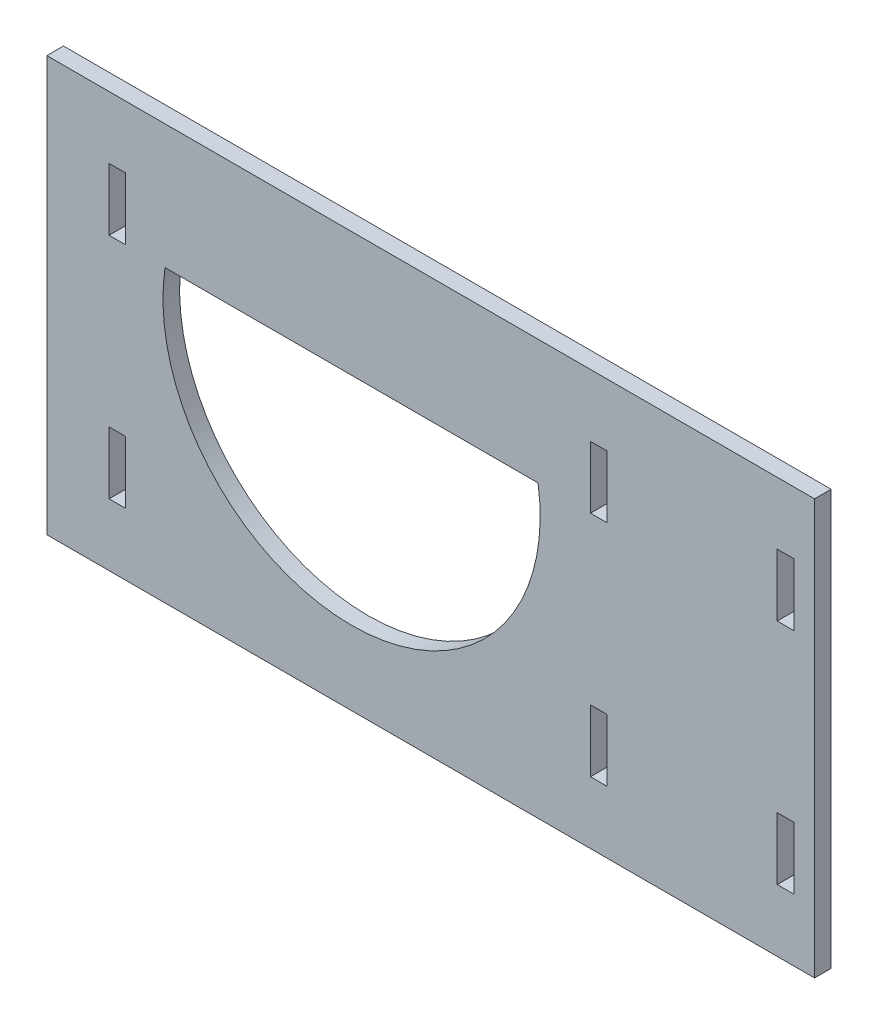
ISO-10303-21;
HEADER;
FILE_DESCRIPTION(('STEP AP214'),'2;1');
FILE_NAME('part.step','',(''),(''),'','','');
FILE_SCHEMA(('AUTOMOTIVE_DESIGN { 1 0 10303 214 1 1 1 1 }'));
ENDSEC;
DATA;
#1=APPLICATION_CONTEXT('core data for automotive mechanical design processes');
#2=APPLICATION_PROTOCOL_DEFINITION('international standard','automotive_design',2000,#1);
#3=PRODUCT_CONTEXT('',#1,'mechanical');
#4=PRODUCT('Part','Part','',(#3));
#5=PRODUCT_RELATED_PRODUCT_CATEGORY('part','',(#4));
#6=PRODUCT_DEFINITION_FORMATION('','',#4);
#7=PRODUCT_DEFINITION_CONTEXT('part definition',#1,'design');
#8=PRODUCT_DEFINITION('design','',#6,#7);
#9=PRODUCT_DEFINITION_SHAPE('','',#8);
#10=(LENGTH_UNIT() NAMED_UNIT(*) SI_UNIT(.MILLI.,.METRE.));
#11=(NAMED_UNIT(*) PLANE_ANGLE_UNIT() SI_UNIT($,.RADIAN.));
#12=(NAMED_UNIT(*) SI_UNIT($,.STERADIAN.) SOLID_ANGLE_UNIT());
#13=UNCERTAINTY_MEASURE_WITH_UNIT(LENGTH_MEASURE(1.E-05),#10,'distance_accuracy_value','');
#14=(GEOMETRIC_REPRESENTATION_CONTEXT(3) GLOBAL_UNCERTAINTY_ASSIGNED_CONTEXT((#13)) GLOBAL_UNIT_ASSIGNED_CONTEXT((#10,
#11,#12)) REPRESENTATION_CONTEXT('',''));
#15=CARTESIAN_POINT('',(0.,0.,0.));
#16=DIRECTION('',(0.,0.,1.));
#17=DIRECTION('',(1.,0.,0.));
#18=AXIS2_PLACEMENT_3D('',#15,#16,#17);
#19=CARTESIAN_POINT('',(0.,0.,4.));
#20=DIRECTION('',(0.,0.,-1.));
#21=DIRECTION('',(-1.,0.,0.));
#22=AXIS2_PLACEMENT_3D('',#19,#20,#21);
#23=PLANE('',#22);
#24=DIRECTION('',(0.,1.,0.));
#25=VECTOR('',#24,1.);
#26=CARTESIAN_POINT('',(105.,35.,4.));
#27=LINE('',#26,#25);
#28=CARTESIAN_POINT('',(105.,20.,4.));
#29=VERTEX_POINT('',#28);
#30=CARTESIAN_POINT('',(105.,35.,4.));
#31=VERTEX_POINT('',#30);
#32=EDGE_CURVE('E266',#29,#31,#27,.T.);
#33=ORIENTED_EDGE('',*,*,#32,.F.);
#34=DIRECTION('',(1.,0.,0.));
#35=VECTOR('',#34,1.);
#36=CARTESIAN_POINT('',(105.,20.,4.));
#37=LINE('',#36,#35);
#38=CARTESIAN_POINT('',(101.,20.,4.));
#39=VERTEX_POINT('',#38);
#40=EDGE_CURVE('E274',#39,#29,#37,.T.);
#41=ORIENTED_EDGE('',*,*,#40,.F.);
#42=DIRECTION('',(0.,-1.,0.));
#43=VECTOR('',#42,1.);
#44=CARTESIAN_POINT('',(101.,35.,4.));
#45=LINE('',#44,#43);
#46=CARTESIAN_POINT('',(101.,35.,4.));
#47=VERTEX_POINT('',#46);
#48=EDGE_CURVE('E271',#47,#39,#45,.T.);
#49=ORIENTED_EDGE('',*,*,#48,.F.);
#50=DIRECTION('',(-1.,0.,0.));
#51=VECTOR('',#50,1.);
#52=CARTESIAN_POINT('',(105.,35.,4.));
#53=LINE('',#52,#51);
#54=EDGE_CURVE('E268',#31,#47,#53,.T.);
#55=ORIENTED_EDGE('',*,*,#54,.F.);
#56=EDGE_LOOP('',(#33,#41,#49,#55));
#57=FACE_BOUND('',#56,.T.);
#58=DIRECTION('',(1.,0.,0.));
#59=VECTOR('',#58,1.);
#60=CARTESIAN_POINT('',(-56.,-35.,4.));
#61=LINE('',#60,#59);
#62=CARTESIAN_POINT('',(-60.,-35.,4.));
#63=VERTEX_POINT('',#62);
#64=CARTESIAN_POINT('',(-56.,-35.,4.));
#65=VERTEX_POINT('',#64);
#66=EDGE_CURVE('E328',#63,#65,#61,.T.);
#67=ORIENTED_EDGE('',*,*,#66,.F.);
#68=DIRECTION('',(0.,-1.,0.));
#69=VECTOR('',#68,1.);
#70=CARTESIAN_POINT('',(-60.,-35.,4.));
#71=LINE('',#70,#69);
#72=CARTESIAN_POINT('',(-60.,-20.,4.));
#73=VERTEX_POINT('',#72);
#74=EDGE_CURVE('E336',#73,#63,#71,.T.);
#75=ORIENTED_EDGE('',*,*,#74,.F.);
#76=DIRECTION('',(-1.,0.,0.));
#77=VECTOR('',#76,1.);
#78=CARTESIAN_POINT('',(-56.,-20.,4.));
#79=LINE('',#78,#77);
#80=CARTESIAN_POINT('',(-56.,-20.,4.));
#81=VERTEX_POINT('',#80);
#82=EDGE_CURVE('E333',#81,#73,#79,.T.);
#83=ORIENTED_EDGE('',*,*,#82,.F.);
#84=DIRECTION('',(0.,1.,0.));
#85=VECTOR('',#84,1.);
#86=CARTESIAN_POINT('',(-56.,-35.,4.));
#87=LINE('',#86,#85);
#88=EDGE_CURVE('E330',#65,#81,#87,.T.);
#89=ORIENTED_EDGE('',*,*,#88,.F.);
#90=EDGE_LOOP('',(#67,#75,#83,#89));
#91=FACE_BOUND('',#90,.T.);
#92=DIRECTION('',(0.,-1.,0.));
#93=VECTOR('',#92,1.);
#94=CARTESIAN_POINT('',(56.,35.,4.));
#95=LINE('',#94,#93);
#96=CARTESIAN_POINT('',(56.,35.,4.));
#97=VERTEX_POINT('',#96);
#98=CARTESIAN_POINT('',(56.,20.,4.));
#99=VERTEX_POINT('',#98);
#100=EDGE_CURVE('E390',#97,#99,#95,.T.);
#101=ORIENTED_EDGE('',*,*,#100,.F.);
#102=DIRECTION('',(-1.,0.,0.));
#103=VECTOR('',#102,1.);
#104=CARTESIAN_POINT('',(56.,35.,4.));
#105=LINE('',#104,#103);
#106=CARTESIAN_POINT('',(60.,35.,4.));
#107=VERTEX_POINT('',#106);
#108=EDGE_CURVE('E398',#107,#97,#105,.T.);
#109=ORIENTED_EDGE('',*,*,#108,.F.);
#110=DIRECTION('',(0.,1.,0.));
#111=VECTOR('',#110,1.);
#112=CARTESIAN_POINT('',(60.,35.,4.));
#113=LINE('',#112,#111);
#114=CARTESIAN_POINT('',(60.,20.,4.));
#115=VERTEX_POINT('',#114);
#116=EDGE_CURVE('E395',#115,#107,#113,.T.);
#117=ORIENTED_EDGE('',*,*,#116,.F.);
#118=DIRECTION('',(1.,0.,0.));
#119=VECTOR('',#118,1.);
#120=CARTESIAN_POINT('',(56.,20.,4.));
#121=LINE('',#120,#119);
#122=EDGE_CURVE('E392',#99,#115,#121,.T.);
#123=ORIENTED_EDGE('',*,*,#122,.F.);
#124=EDGE_LOOP('',(#101,#109,#117,#123));
#125=FACE_BOUND('',#124,.T.);
#126=DIRECTION('',(-1.,0.,0.));
#127=VECTOR('',#126,1.);
#128=CARTESIAN_POINT('',(75.,50.,4.));
#129=LINE('',#128,#127);
#130=CARTESIAN_POINT('',(110.,50.,4.));
#131=VERTEX_POINT('',#130);
#132=CARTESIAN_POINT('',(-75.,50.,4.));
#133=VERTEX_POINT('',#132);
#134=EDGE_CURVE('E438',#131,#133,#129,.T.);
#135=ORIENTED_EDGE('',*,*,#134,.T.);
#136=DIRECTION('',(0.,-1.,0.));
#137=VECTOR('',#136,1.);
#138=CARTESIAN_POINT('',(-75.,50.,4.));
#139=LINE('',#138,#137);
#140=CARTESIAN_POINT('',(-75.,-50.,4.));
#141=VERTEX_POINT('',#140);
#142=EDGE_CURVE('E440',#133,#141,#139,.T.);
#143=ORIENTED_EDGE('',*,*,#142,.T.);
#144=DIRECTION('',(1.,0.,0.));
#145=VECTOR('',#144,1.);
#146=CARTESIAN_POINT('',(-75.,-50.,4.));
#147=LINE('',#146,#145);
#148=CARTESIAN_POINT('',(110.,-50.,4.));
#149=VERTEX_POINT('',#148);
#150=EDGE_CURVE('E443',#141,#149,#147,.T.);
#151=ORIENTED_EDGE('',*,*,#150,.T.);
#152=DIRECTION('',(0.,1.,0.));
#153=VECTOR('',#152,1.);
#154=CARTESIAN_POINT('',(110.,50.,4.));
#155=LINE('',#154,#153);
#156=EDGE_CURVE('E445',#149,#131,#155,.T.);
#157=ORIENTED_EDGE('',*,*,#156,.T.);
#158=EDGE_LOOP('',(#135,#143,#151,#157));
#159=FACE_BOUND('',#158,.T.);
#160=CARTESIAN_POINT('',(-1.57065424336213,13.2673761716235,4.));
#161=DIRECTION('',(0.,0.,1.));
#162=DIRECTION('',(1.,0.,0.));
#163=AXIS2_PLACEMENT_3D('',#160,#161,#162);
#164=CIRCLE('',#163,45.4470877340791);
#165=CARTESIAN_POINT('',(-46.5162831731553,20.,4.));
#166=VERTEX_POINT('',#165);
#167=CARTESIAN_POINT('',(43.374974686431,20.,4.));
#168=VERTEX_POINT('',#167);
#169=EDGE_CURVE('E421',#166,#168,#164,.T.);
#170=ORIENTED_EDGE('',*,*,#169,.F.);
#171=DIRECTION('',(-1.,0.,0.));
#172=VECTOR('',#171,1.);
#173=CARTESIAN_POINT('',(-46.5162831731553,20.,4.));
#174=LINE('',#173,#172);
#175=EDGE_CURVE('E424',#168,#166,#174,.T.);
#176=ORIENTED_EDGE('',*,*,#175,.F.);
#177=EDGE_LOOP('',(#170,#176));
#178=FACE_BOUND('',#177,.T.);
#179=DIRECTION('',(0.,-1.,0.));
#180=VECTOR('',#179,1.);
#181=CARTESIAN_POINT('',(56.,-35.,4.));
#182=LINE('',#181,#180);
#183=CARTESIAN_POINT('',(56.,-20.,4.));
#184=VERTEX_POINT('',#183);
#185=CARTESIAN_POINT('',(56.,-35.,4.));
#186=VERTEX_POINT('',#185);
#187=EDGE_CURVE('E359',#184,#186,#182,.T.);
#188=ORIENTED_EDGE('',*,*,#187,.F.);
#189=DIRECTION('',(-1.,0.,0.));
#190=VECTOR('',#189,1.);
#191=CARTESIAN_POINT('',(56.,-20.,4.));
#192=LINE('',#191,#190);
#193=CARTESIAN_POINT('',(60.,-20.,4.));
#194=VERTEX_POINT('',#193);
#195=EDGE_CURVE('E367',#194,#184,#192,.T.);
#196=ORIENTED_EDGE('',*,*,#195,.F.);
#197=DIRECTION('',(0.,1.,0.));
#198=VECTOR('',#197,1.);
#199=CARTESIAN_POINT('',(60.,-35.,4.));
#200=LINE('',#199,#198);
#201=CARTESIAN_POINT('',(60.,-35.,4.));
#202=VERTEX_POINT('',#201);
#203=EDGE_CURVE('E364',#202,#194,#200,.T.);
#204=ORIENTED_EDGE('',*,*,#203,.F.);
#205=DIRECTION('',(1.,0.,0.));
#206=VECTOR('',#205,1.);
#207=CARTESIAN_POINT('',(56.,-35.,4.));
#208=LINE('',#207,#206);
#209=EDGE_CURVE('E361',#186,#202,#208,.T.);
#210=ORIENTED_EDGE('',*,*,#209,.F.);
#211=EDGE_LOOP('',(#188,#196,#204,#210));
#212=FACE_BOUND('',#211,.T.);
#213=DIRECTION('',(0.,1.,0.));
#214=VECTOR('',#213,1.);
#215=CARTESIAN_POINT('',(-56.,35.,4.));
#216=LINE('',#215,#214);
#217=CARTESIAN_POINT('',(-56.,20.,4.));
#218=VERTEX_POINT('',#217);
#219=CARTESIAN_POINT('',(-56.,35.,4.));
#220=VERTEX_POINT('',#219);
#221=EDGE_CURVE('E297',#218,#220,#216,.T.);
#222=ORIENTED_EDGE('',*,*,#221,.F.);
#223=DIRECTION('',(1.,0.,0.));
#224=VECTOR('',#223,1.);
#225=CARTESIAN_POINT('',(-56.,20.,4.));
#226=LINE('',#225,#224);
#227=CARTESIAN_POINT('',(-60.,20.,4.));
#228=VERTEX_POINT('',#227);
#229=EDGE_CURVE('E305',#228,#218,#226,.T.);
#230=ORIENTED_EDGE('',*,*,#229,.F.);
#231=DIRECTION('',(0.,-1.,0.));
#232=VECTOR('',#231,1.);
#233=CARTESIAN_POINT('',(-60.,35.,4.));
#234=LINE('',#233,#232);
#235=CARTESIAN_POINT('',(-60.,35.,4.));
#236=VERTEX_POINT('',#235);
#237=EDGE_CURVE('E302',#236,#228,#234,.T.);
#238=ORIENTED_EDGE('',*,*,#237,.F.);
#239=DIRECTION('',(-1.,0.,0.));
#240=VECTOR('',#239,1.);
#241=CARTESIAN_POINT('',(-56.,35.,4.));
#242=LINE('',#241,#240);
#243=EDGE_CURVE('E299',#220,#236,#242,.T.);
#244=ORIENTED_EDGE('',*,*,#243,.F.);
#245=EDGE_LOOP('',(#222,#230,#238,#244));
#246=FACE_BOUND('',#245,.T.);
#247=DIRECTION('',(0.,1.,0.));
#248=VECTOR('',#247,1.);
#249=CARTESIAN_POINT('',(105.,-20.,4.));
#250=LINE('',#249,#248);
#251=CARTESIAN_POINT('',(105.,-35.,4.));
#252=VERTEX_POINT('',#251);
#253=CARTESIAN_POINT('',(105.,-20.,4.));
#254=VERTEX_POINT('',#253);
#255=EDGE_CURVE('E230',#252,#254,#250,.T.);
#256=ORIENTED_EDGE('',*,*,#255,.F.);
#257=DIRECTION('',(1.,0.,0.));
#258=VECTOR('',#257,1.);
#259=CARTESIAN_POINT('',(105.,-35.,4.));
#260=LINE('',#259,#258);
#261=CARTESIAN_POINT('',(101.,-35.,4.));
#262=VERTEX_POINT('',#261);
#263=EDGE_CURVE('E252',#262,#252,#260,.T.);
#264=ORIENTED_EDGE('',*,*,#263,.F.);
#265=DIRECTION('',(0.,-1.,0.));
#266=VECTOR('',#265,1.);
#267=CARTESIAN_POINT('',(101.,-20.,4.));
#268=LINE('',#267,#266);
#269=CARTESIAN_POINT('',(101.,-20.,4.));
#270=VERTEX_POINT('',#269);
#271=EDGE_CURVE('E250',#270,#262,#268,.T.);
#272=ORIENTED_EDGE('',*,*,#271,.F.);
#273=DIRECTION('',(-1.,0.,0.));
#274=VECTOR('',#273,1.);
#275=CARTESIAN_POINT('',(105.,-20.,4.));
#276=LINE('',#275,#274);
#277=EDGE_CURVE('E238',#254,#270,#276,.T.);
#278=ORIENTED_EDGE('',*,*,#277,.F.);
#279=EDGE_LOOP('',(#256,#264,#272,#278));
#280=FACE_BOUND('',#279,.T.);
#281=ADVANCED_FACE('F33',(#57,#91,#125,#159,#178,#212,#246,#280),#23,.F.);
#282=CARTESIAN_POINT('',(0.,0.,0.));
#283=DIRECTION('',(0.,0.,-1.));
#284=DIRECTION('',(-1.,0.,0.));
#285=AXIS2_PLACEMENT_3D('',#282,#283,#284);
#286=PLANE('',#285);
#287=DIRECTION('',(-1.,0.,0.));
#288=VECTOR('',#287,1.);
#289=CARTESIAN_POINT('',(-75.,50.,0.));
#290=LINE('',#289,#288);
#291=CARTESIAN_POINT('',(110.,50.,0.));
#292=VERTEX_POINT('',#291);
#293=CARTESIAN_POINT('',(-75.,50.,0.));
#294=VERTEX_POINT('',#293);
#295=EDGE_CURVE('E437',#292,#294,#290,.T.);
#296=ORIENTED_EDGE('',*,*,#295,.F.);
#297=DIRECTION('',(0.,1.,0.));
#298=VECTOR('',#297,1.);
#299=CARTESIAN_POINT('',(110.,50.,0.));
#300=LINE('',#299,#298);
#301=CARTESIAN_POINT('',(110.,-50.,0.));
#302=VERTEX_POINT('',#301);
#303=EDGE_CURVE('E441',#302,#292,#300,.T.);
#304=ORIENTED_EDGE('',*,*,#303,.F.);
#305=DIRECTION('',(1.,0.,0.));
#306=VECTOR('',#305,1.);
#307=CARTESIAN_POINT('',(110.,-50.,0.));
#308=LINE('',#307,#306);
#309=CARTESIAN_POINT('',(-75.,-50.,0.));
#310=VERTEX_POINT('',#309);
#311=EDGE_CURVE('E452',#310,#302,#308,.T.);
#312=ORIENTED_EDGE('',*,*,#311,.F.);
#313=DIRECTION('',(0.,-1.,0.));
#314=VECTOR('',#313,1.);
#315=CARTESIAN_POINT('',(-75.,50.,0.));
#316=LINE('',#315,#314);
#317=EDGE_CURVE('E449',#294,#310,#316,.T.);
#318=ORIENTED_EDGE('',*,*,#317,.F.);
#319=EDGE_LOOP('',(#296,#304,#312,#318));
#320=FACE_BOUND('',#319,.T.);
#321=DIRECTION('',(-1.,0.,0.));
#322=VECTOR('',#321,1.);
#323=CARTESIAN_POINT('',(-46.5162831731553,20.,0.));
#324=LINE('',#323,#322);
#325=CARTESIAN_POINT('',(43.374974686431,20.,0.));
#326=VERTEX_POINT('',#325);
#327=CARTESIAN_POINT('',(-46.5162831731553,20.,0.));
#328=VERTEX_POINT('',#327);
#329=EDGE_CURVE('E425',#326,#328,#324,.T.);
#330=ORIENTED_EDGE('',*,*,#329,.T.);
#331=CARTESIAN_POINT('',(-1.57065424336213,13.2673761716235,0.));
#332=DIRECTION('',(0.,0.,1.));
#333=DIRECTION('',(1.,0.,0.));
#334=AXIS2_PLACEMENT_3D('',#331,#332,#333);
#335=CIRCLE('',#334,45.4470877340791);
#336=EDGE_CURVE('E420',#328,#326,#335,.T.);
#337=ORIENTED_EDGE('',*,*,#336,.T.);
#338=EDGE_LOOP('',(#330,#337));
#339=FACE_BOUND('',#338,.T.);
#340=DIRECTION('',(-1.,0.,0.));
#341=VECTOR('',#340,1.);
#342=CARTESIAN_POINT('',(56.,35.,0.));
#343=LINE('',#342,#341);
#344=CARTESIAN_POINT('',(60.,35.,0.));
#345=VERTEX_POINT('',#344);
#346=CARTESIAN_POINT('',(56.,35.,0.));
#347=VERTEX_POINT('',#346);
#348=EDGE_CURVE('E393',#345,#347,#343,.T.);
#349=ORIENTED_EDGE('',*,*,#348,.T.);
#350=DIRECTION('',(0.,-1.,0.));
#351=VECTOR('',#350,1.);
#352=CARTESIAN_POINT('',(56.,35.,0.));
#353=LINE('',#352,#351);
#354=CARTESIAN_POINT('',(56.,20.,0.));
#355=VERTEX_POINT('',#354);
#356=EDGE_CURVE('E389',#347,#355,#353,.T.);
#357=ORIENTED_EDGE('',*,*,#356,.T.);
#358=DIRECTION('',(1.,0.,0.));
#359=VECTOR('',#358,1.);
#360=CARTESIAN_POINT('',(56.,20.,0.));
#361=LINE('',#360,#359);
#362=CARTESIAN_POINT('',(60.,20.,0.));
#363=VERTEX_POINT('',#362);
#364=EDGE_CURVE('E403',#355,#363,#361,.T.);
#365=ORIENTED_EDGE('',*,*,#364,.T.);
#366=DIRECTION('',(0.,1.,0.));
#367=VECTOR('',#366,1.);
#368=CARTESIAN_POINT('',(60.,35.,0.));
#369=LINE('',#368,#367);
#370=EDGE_CURVE('E406',#363,#345,#369,.T.);
#371=ORIENTED_EDGE('',*,*,#370,.T.);
#372=EDGE_LOOP('',(#349,#357,#365,#371));
#373=FACE_BOUND('',#372,.T.);
#374=DIRECTION('',(-1.,0.,0.));
#375=VECTOR('',#374,1.);
#376=CARTESIAN_POINT('',(56.,-20.,0.));
#377=LINE('',#376,#375);
#378=CARTESIAN_POINT('',(60.,-20.,0.));
#379=VERTEX_POINT('',#378);
#380=CARTESIAN_POINT('',(56.,-20.,0.));
#381=VERTEX_POINT('',#380);
#382=EDGE_CURVE('E362',#379,#381,#377,.T.);
#383=ORIENTED_EDGE('',*,*,#382,.T.);
#384=DIRECTION('',(0.,-1.,0.));
#385=VECTOR('',#384,1.);
#386=CARTESIAN_POINT('',(56.,-35.,0.));
#387=LINE('',#386,#385);
#388=CARTESIAN_POINT('',(56.,-35.,0.));
#389=VERTEX_POINT('',#388);
#390=EDGE_CURVE('E358',#381,#389,#387,.T.);
#391=ORIENTED_EDGE('',*,*,#390,.T.);
#392=DIRECTION('',(1.,0.,0.));
#393=VECTOR('',#392,1.);
#394=CARTESIAN_POINT('',(56.,-35.,0.));
#395=LINE('',#394,#393);
#396=CARTESIAN_POINT('',(60.,-35.,0.));
#397=VERTEX_POINT('',#396);
#398=EDGE_CURVE('E372',#389,#397,#395,.T.);
#399=ORIENTED_EDGE('',*,*,#398,.T.);
#400=DIRECTION('',(0.,1.,0.));
#401=VECTOR('',#400,1.);
#402=CARTESIAN_POINT('',(60.,-35.,0.));
#403=LINE('',#402,#401);
#404=EDGE_CURVE('E375',#397,#379,#403,.T.);
#405=ORIENTED_EDGE('',*,*,#404,.T.);
#406=EDGE_LOOP('',(#383,#391,#399,#405));
#407=FACE_BOUND('',#406,.T.);
#408=DIRECTION('',(0.,-1.,0.));
#409=VECTOR('',#408,1.);
#410=CARTESIAN_POINT('',(-60.,-35.,0.));
#411=LINE('',#410,#409);
#412=CARTESIAN_POINT('',(-60.,-20.,0.));
#413=VERTEX_POINT('',#412);
#414=CARTESIAN_POINT('',(-60.,-35.,0.));
#415=VERTEX_POINT('',#414);
#416=EDGE_CURVE('E331',#413,#415,#411,.T.);
#417=ORIENTED_EDGE('',*,*,#416,.T.);
#418=DIRECTION('',(1.,0.,0.));
#419=VECTOR('',#418,1.);
#420=CARTESIAN_POINT('',(-56.,-35.,0.));
#421=LINE('',#420,#419);
#422=CARTESIAN_POINT('',(-56.,-35.,0.));
#423=VERTEX_POINT('',#422);
#424=EDGE_CURVE('E327',#415,#423,#421,.T.);
#425=ORIENTED_EDGE('',*,*,#424,.T.);
#426=DIRECTION('',(0.,1.,0.));
#427=VECTOR('',#426,1.);
#428=CARTESIAN_POINT('',(-56.,-35.,0.));
#429=LINE('',#428,#427);
#430=CARTESIAN_POINT('',(-56.,-20.,0.));
#431=VERTEX_POINT('',#430);
#432=EDGE_CURVE('E341',#423,#431,#429,.T.);
#433=ORIENTED_EDGE('',*,*,#432,.T.);
#434=DIRECTION('',(-1.,0.,0.));
#435=VECTOR('',#434,1.);
#436=CARTESIAN_POINT('',(-56.,-20.,0.));
#437=LINE('',#436,#435);
#438=EDGE_CURVE('E344',#431,#413,#437,.T.);
#439=ORIENTED_EDGE('',*,*,#438,.T.);
#440=EDGE_LOOP('',(#417,#425,#433,#439));
#441=FACE_BOUND('',#440,.T.);
#442=DIRECTION('',(1.,0.,0.));
#443=VECTOR('',#442,1.);
#444=CARTESIAN_POINT('',(-56.,20.,0.));
#445=LINE('',#444,#443);
#446=CARTESIAN_POINT('',(-60.,20.,0.));
#447=VERTEX_POINT('',#446);
#448=CARTESIAN_POINT('',(-56.,20.,0.));
#449=VERTEX_POINT('',#448);
#450=EDGE_CURVE('E300',#447,#449,#445,.T.);
#451=ORIENTED_EDGE('',*,*,#450,.T.);
#452=DIRECTION('',(0.,1.,0.));
#453=VECTOR('',#452,1.);
#454=CARTESIAN_POINT('',(-56.,35.,0.));
#455=LINE('',#454,#453);
#456=CARTESIAN_POINT('',(-56.,35.,0.));
#457=VERTEX_POINT('',#456);
#458=EDGE_CURVE('E296',#449,#457,#455,.T.);
#459=ORIENTED_EDGE('',*,*,#458,.T.);
#460=DIRECTION('',(-1.,0.,0.));
#461=VECTOR('',#460,1.);
#462=CARTESIAN_POINT('',(-56.,35.,0.));
#463=LINE('',#462,#461);
#464=CARTESIAN_POINT('',(-60.,35.,0.));
#465=VERTEX_POINT('',#464);
#466=EDGE_CURVE('E310',#457,#465,#463,.T.);
#467=ORIENTED_EDGE('',*,*,#466,.T.);
#468=DIRECTION('',(0.,-1.,0.));
#469=VECTOR('',#468,1.);
#470=CARTESIAN_POINT('',(-60.,35.,0.));
#471=LINE('',#470,#469);
#472=EDGE_CURVE('E313',#465,#447,#471,.T.);
#473=ORIENTED_EDGE('',*,*,#472,.T.);
#474=EDGE_LOOP('',(#451,#459,#467,#473));
#475=FACE_BOUND('',#474,.T.);
#476=DIRECTION('',(1.,0.,0.));
#477=VECTOR('',#476,1.);
#478=CARTESIAN_POINT('',(105.,20.,0.));
#479=LINE('',#478,#477);
#480=CARTESIAN_POINT('',(101.,20.,0.));
#481=VERTEX_POINT('',#480);
#482=CARTESIAN_POINT('',(105.,20.,0.));
#483=VERTEX_POINT('',#482);
#484=EDGE_CURVE('E269',#481,#483,#479,.T.);
#485=ORIENTED_EDGE('',*,*,#484,.T.);
#486=DIRECTION('',(0.,1.,0.));
#487=VECTOR('',#486,1.);
#488=CARTESIAN_POINT('',(105.,35.,0.));
#489=LINE('',#488,#487);
#490=CARTESIAN_POINT('',(105.,35.,0.));
#491=VERTEX_POINT('',#490);
#492=EDGE_CURVE('E246',#483,#491,#489,.T.);
#493=ORIENTED_EDGE('',*,*,#492,.T.);
#494=DIRECTION('',(-1.,0.,0.));
#495=VECTOR('',#494,1.);
#496=CARTESIAN_POINT('',(105.,35.,0.));
#497=LINE('',#496,#495);
#498=CARTESIAN_POINT('',(101.,35.,0.));
#499=VERTEX_POINT('',#498);
#500=EDGE_CURVE('E279',#491,#499,#497,.T.);
#501=ORIENTED_EDGE('',*,*,#500,.T.);
#502=DIRECTION('',(0.,-1.,0.));
#503=VECTOR('',#502,1.);
#504=CARTESIAN_POINT('',(101.,35.,0.));
#505=LINE('',#504,#503);
#506=EDGE_CURVE('E282',#499,#481,#505,.T.);
#507=ORIENTED_EDGE('',*,*,#506,.T.);
#508=EDGE_LOOP('',(#485,#493,#501,#507));
#509=FACE_BOUND('',#508,.T.);
#510=DIRECTION('',(1.,0.,0.));
#511=VECTOR('',#510,1.);
#512=CARTESIAN_POINT('',(105.,-35.,0.));
#513=LINE('',#512,#511);
#514=CARTESIAN_POINT('',(101.,-35.,0.));
#515=VERTEX_POINT('',#514);
#516=CARTESIAN_POINT('',(105.,-35.,0.));
#517=VERTEX_POINT('',#516);
#518=EDGE_CURVE('E239',#515,#517,#513,.T.);
#519=ORIENTED_EDGE('',*,*,#518,.T.);
#520=DIRECTION('',(0.,1.,0.));
#521=VECTOR('',#520,1.);
#522=CARTESIAN_POINT('',(105.,-20.,0.));
#523=LINE('',#522,#521);
#524=CARTESIAN_POINT('',(105.,-20.,0.));
#525=VERTEX_POINT('',#524);
#526=EDGE_CURVE('E56',#517,#525,#523,.T.);
#527=ORIENTED_EDGE('',*,*,#526,.T.);
#528=DIRECTION('',(-1.,0.,0.));
#529=VECTOR('',#528,1.);
#530=CARTESIAN_POINT('',(105.,-20.,0.));
#531=LINE('',#530,#529);
#532=CARTESIAN_POINT('',(101.,-20.,0.));
#533=VERTEX_POINT('',#532);
#534=EDGE_CURVE('E245',#525,#533,#531,.T.);
#535=ORIENTED_EDGE('',*,*,#534,.T.);
#536=DIRECTION('',(0.,-1.,0.));
#537=VECTOR('',#536,1.);
#538=CARTESIAN_POINT('',(101.,-20.,0.));
#539=LINE('',#538,#537);
#540=EDGE_CURVE('E258',#533,#515,#539,.T.);
#541=ORIENTED_EDGE('',*,*,#540,.T.);
#542=EDGE_LOOP('',(#519,#527,#535,#541));
#543=FACE_BOUND('',#542,.T.);
#544=ADVANCED_FACE('F472',(#320,#339,#373,#407,#441,#475,#509,#543),#286,.T.);
#545=CARTESIAN_POINT('',(-75.,50.,4.));
#546=DIRECTION('',(0.,-1.,0.));
#547=DIRECTION('',(0.,0.,-1.));
#548=AXIS2_PLACEMENT_3D('',#545,#546,#547);
#549=PLANE('',#548);
#550=ORIENTED_EDGE('',*,*,#295,.T.);
#551=DIRECTION('',(0.,0.,-1.));
#552=VECTOR('',#551,1.);
#553=CARTESIAN_POINT('',(-75.,50.,4.));
#554=LINE('',#553,#552);
#555=EDGE_CURVE('E11',#133,#294,#554,.T.);
#556=ORIENTED_EDGE('',*,*,#555,.F.);
#557=ORIENTED_EDGE('',*,*,#134,.F.);
#558=DIRECTION('',(0.,0.,-1.));
#559=VECTOR('',#558,1.);
#560=CARTESIAN_POINT('',(110.,50.,4.));
#561=LINE('',#560,#559);
#562=EDGE_CURVE('E447',#131,#292,#561,.T.);
#563=ORIENTED_EDGE('',*,*,#562,.T.);
#564=EDGE_LOOP('',(#550,#556,#557,#563));
#565=FACE_BOUND('',#564,.T.);
#566=ADVANCED_FACE('F35',(#565),#549,.F.);
#567=CARTESIAN_POINT('',(-75.,50.,4.));
#568=DIRECTION('',(1.,0.,0.));
#569=DIRECTION('',(0.,0.,-1.));
#570=AXIS2_PLACEMENT_3D('',#567,#568,#569);
#571=PLANE('',#570);
#572=ORIENTED_EDGE('',*,*,#317,.T.);
#573=DIRECTION('',(0.,0.,-1.));
#574=VECTOR('',#573,1.);
#575=CARTESIAN_POINT('',(-75.,-50.,4.));
#576=LINE('',#575,#574);
#577=EDGE_CURVE('E41',#141,#310,#576,.T.);
#578=ORIENTED_EDGE('',*,*,#577,.F.);
#579=ORIENTED_EDGE('',*,*,#142,.F.);
#580=ORIENTED_EDGE('',*,*,#555,.T.);
#581=EDGE_LOOP('',(#572,#578,#579,#580));
#582=FACE_BOUND('',#581,.T.);
#583=ADVANCED_FACE('F468',(#582),#571,.F.);
#584=CARTESIAN_POINT('',(110.,-50.,4.));
#585=DIRECTION('',(0.,1.,0.));
#586=DIRECTION('',(-1.,0.,0.));
#587=AXIS2_PLACEMENT_3D('',#584,#585,#586);
#588=PLANE('',#587);
#589=ORIENTED_EDGE('',*,*,#311,.T.);
#590=DIRECTION('',(0.,0.,-1.));
#591=VECTOR('',#590,1.);
#592=CARTESIAN_POINT('',(110.,-50.,4.));
#593=LINE('',#592,#591);
#594=EDGE_CURVE('E458',#149,#302,#593,.T.);
#595=ORIENTED_EDGE('',*,*,#594,.F.);
#596=ORIENTED_EDGE('',*,*,#150,.F.);
#597=ORIENTED_EDGE('',*,*,#577,.T.);
#598=EDGE_LOOP('',(#589,#595,#596,#597));
#599=FACE_BOUND('',#598,.T.);
#600=ADVANCED_FACE('F464',(#599),#588,.F.);
#601=CARTESIAN_POINT('',(110.,50.,4.));
#602=DIRECTION('',(-1.,0.,0.));
#603=DIRECTION('',(0.,0.,1.));
#604=AXIS2_PLACEMENT_3D('',#601,#602,#603);
#605=PLANE('',#604);
#606=ORIENTED_EDGE('',*,*,#303,.T.);
#607=ORIENTED_EDGE('',*,*,#562,.F.);
#608=ORIENTED_EDGE('',*,*,#156,.F.);
#609=ORIENTED_EDGE('',*,*,#594,.T.);
#610=EDGE_LOOP('',(#606,#607,#608,#609));
#611=FACE_BOUND('',#610,.T.);
#612=ADVANCED_FACE('F477',(#611),#605,.F.);
#613=CARTESIAN_POINT('',(-1.57065424336213,13.2673761716235,4.));
#614=DIRECTION('',(0.,0.,-1.));
#615=DIRECTION('',(-1.,0.,0.));
#616=AXIS2_PLACEMENT_3D('',#613,#614,#615);
#617=CYLINDRICAL_SURFACE('',#616,45.4470877340791);
#618=ORIENTED_EDGE('',*,*,#336,.F.);
#619=DIRECTION('',(0.,0.,-1.));
#620=VECTOR('',#619,1.);
#621=CARTESIAN_POINT('',(-46.5162831731553,20.,4.));
#622=LINE('',#621,#620);
#623=EDGE_CURVE('E427',#166,#328,#622,.T.);
#624=ORIENTED_EDGE('',*,*,#623,.F.);
#625=ORIENTED_EDGE('',*,*,#169,.T.);
#626=DIRECTION('',(0.,0.,-1.));
#627=VECTOR('',#626,1.);
#628=CARTESIAN_POINT('',(43.374974686431,20.,4.));
#629=LINE('',#628,#627);
#630=EDGE_CURVE('E434',#168,#326,#629,.T.);
#631=ORIENTED_EDGE('',*,*,#630,.T.);
#632=EDGE_LOOP('',(#618,#624,#625,#631));
#633=FACE_BOUND('',#632,.T.);
#634=ADVANCED_FACE('F576',(#633),#617,.F.);
#635=CARTESIAN_POINT('',(-46.5162831731553,20.,4.));
#636=DIRECTION('',(0.,-1.,0.));
#637=DIRECTION('',(0.,0.,-1.));
#638=AXIS2_PLACEMENT_3D('',#635,#636,#637);
#639=PLANE('',#638);
#640=ORIENTED_EDGE('',*,*,#329,.F.);
#641=ORIENTED_EDGE('',*,*,#630,.F.);
#642=ORIENTED_EDGE('',*,*,#175,.T.);
#643=ORIENTED_EDGE('',*,*,#623,.T.);
#644=EDGE_LOOP('',(#640,#641,#642,#643));
#645=FACE_BOUND('',#644,.T.);
#646=ADVANCED_FACE('F572',(#645),#639,.T.);
#647=CARTESIAN_POINT('',(56.,35.,4.));
#648=DIRECTION('',(1.,0.,0.));
#649=DIRECTION('',(0.,1.,0.));
#650=AXIS2_PLACEMENT_3D('',#647,#648,#649);
#651=PLANE('',#650);
#652=ORIENTED_EDGE('',*,*,#356,.F.);
#653=DIRECTION('',(0.,0.,-1.));
#654=VECTOR('',#653,1.);
#655=CARTESIAN_POINT('',(56.,35.,4.));
#656=LINE('',#655,#654);
#657=EDGE_CURVE('E400',#97,#347,#656,.T.);
#658=ORIENTED_EDGE('',*,*,#657,.F.);
#659=ORIENTED_EDGE('',*,*,#100,.T.);
#660=DIRECTION('',(0.,0.,-1.));
#661=VECTOR('',#660,1.);
#662=CARTESIAN_POINT('',(56.,20.,4.));
#663=LINE('',#662,#661);
#664=EDGE_CURVE('E417',#99,#355,#663,.T.);
#665=ORIENTED_EDGE('',*,*,#664,.T.);
#666=EDGE_LOOP('',(#652,#658,#659,#665));
#667=FACE_BOUND('',#666,.T.);
#668=ADVANCED_FACE('F568',(#667),#651,.T.);
#669=CARTESIAN_POINT('',(56.,20.,4.));
#670=DIRECTION('',(0.,1.,0.));
#671=DIRECTION('',(0.,0.,1.));
#672=AXIS2_PLACEMENT_3D('',#669,#670,#671);
#673=PLANE('',#672);
#674=ORIENTED_EDGE('',*,*,#364,.F.);
#675=ORIENTED_EDGE('',*,*,#664,.F.);
#676=ORIENTED_EDGE('',*,*,#122,.T.);
#677=DIRECTION('',(0.,0.,-1.));
#678=VECTOR('',#677,1.);
#679=CARTESIAN_POINT('',(60.,20.,4.));
#680=LINE('',#679,#678);
#681=EDGE_CURVE('E415',#115,#363,#680,.T.);
#682=ORIENTED_EDGE('',*,*,#681,.T.);
#683=EDGE_LOOP('',(#674,#675,#676,#682));
#684=FACE_BOUND('',#683,.T.);
#685=ADVANCED_FACE('F564',(#684),#673,.T.);
#686=CARTESIAN_POINT('',(60.,35.,4.));
#687=DIRECTION('',(-1.,0.,0.));
#688=DIRECTION('',(0.,0.,1.));
#689=AXIS2_PLACEMENT_3D('',#686,#687,#688);
#690=PLANE('',#689);
#691=ORIENTED_EDGE('',*,*,#370,.F.);
#692=ORIENTED_EDGE('',*,*,#681,.F.);
#693=ORIENTED_EDGE('',*,*,#116,.T.);
#694=DIRECTION('',(0.,0.,-1.));
#695=VECTOR('',#694,1.);
#696=CARTESIAN_POINT('',(60.,35.,4.));
#697=LINE('',#696,#695);
#698=EDGE_CURVE('E413',#107,#345,#697,.T.);
#699=ORIENTED_EDGE('',*,*,#698,.T.);
#700=EDGE_LOOP('',(#691,#692,#693,#699));
#701=FACE_BOUND('',#700,.T.);
#702=ADVANCED_FACE('F560',(#701),#690,.T.);
#703=CARTESIAN_POINT('',(56.,35.,4.));
#704=DIRECTION('',(0.,-1.,0.));
#705=DIRECTION('',(0.,0.,-1.));
#706=AXIS2_PLACEMENT_3D('',#703,#704,#705);
#707=PLANE('',#706);
#708=ORIENTED_EDGE('',*,*,#348,.F.);
#709=ORIENTED_EDGE('',*,*,#698,.F.);
#710=ORIENTED_EDGE('',*,*,#108,.T.);
#711=ORIENTED_EDGE('',*,*,#657,.T.);
#712=EDGE_LOOP('',(#708,#709,#710,#711));
#713=FACE_BOUND('',#712,.T.);
#714=ADVANCED_FACE('F556',(#713),#707,.T.);
#715=CARTESIAN_POINT('',(56.,-35.,4.));
#716=DIRECTION('',(1.,0.,0.));
#717=DIRECTION('',(0.,1.,0.));
#718=AXIS2_PLACEMENT_3D('',#715,#716,#717);
#719=PLANE('',#718);
#720=ORIENTED_EDGE('',*,*,#390,.F.);
#721=DIRECTION('',(0.,0.,-1.));
#722=VECTOR('',#721,1.);
#723=CARTESIAN_POINT('',(56.,-20.,4.));
#724=LINE('',#723,#722);
#725=EDGE_CURVE('E369',#184,#381,#724,.T.);
#726=ORIENTED_EDGE('',*,*,#725,.F.);
#727=ORIENTED_EDGE('',*,*,#187,.T.);
#728=DIRECTION('',(0.,0.,-1.));
#729=VECTOR('',#728,1.);
#730=CARTESIAN_POINT('',(56.,-35.,4.));
#731=LINE('',#730,#729);
#732=EDGE_CURVE('E386',#186,#389,#731,.T.);
#733=ORIENTED_EDGE('',*,*,#732,.T.);
#734=EDGE_LOOP('',(#720,#726,#727,#733));
#735=FACE_BOUND('',#734,.T.);
#736=ADVANCED_FACE('F552',(#735),#719,.T.);
#737=CARTESIAN_POINT('',(56.,-35.,4.));
#738=DIRECTION('',(0.,1.,0.));
#739=DIRECTION('',(0.,0.,1.));
#740=AXIS2_PLACEMENT_3D('',#737,#738,#739);
#741=PLANE('',#740);
#742=ORIENTED_EDGE('',*,*,#398,.F.);
#743=ORIENTED_EDGE('',*,*,#732,.F.);
#744=ORIENTED_EDGE('',*,*,#209,.T.);
#745=DIRECTION('',(0.,0.,-1.));
#746=VECTOR('',#745,1.);
#747=CARTESIAN_POINT('',(60.,-35.,4.));
#748=LINE('',#747,#746);
#749=EDGE_CURVE('E384',#202,#397,#748,.T.);
#750=ORIENTED_EDGE('',*,*,#749,.T.);
#751=EDGE_LOOP('',(#742,#743,#744,#750));
#752=FACE_BOUND('',#751,.T.);
#753=ADVANCED_FACE('F548',(#752),#741,.T.);
#754=CARTESIAN_POINT('',(60.,-35.,4.));
#755=DIRECTION('',(-1.,0.,0.));
#756=DIRECTION('',(0.,0.,1.));
#757=AXIS2_PLACEMENT_3D('',#754,#755,#756);
#758=PLANE('',#757);
#759=ORIENTED_EDGE('',*,*,#404,.F.);
#760=ORIENTED_EDGE('',*,*,#749,.F.);
#761=ORIENTED_EDGE('',*,*,#203,.T.);
#762=DIRECTION('',(0.,0.,-1.));
#763=VECTOR('',#762,1.);
#764=CARTESIAN_POINT('',(60.,-20.,4.));
#765=LINE('',#764,#763);
#766=EDGE_CURVE('E382',#194,#379,#765,.T.);
#767=ORIENTED_EDGE('',*,*,#766,.T.);
#768=EDGE_LOOP('',(#759,#760,#761,#767));
#769=FACE_BOUND('',#768,.T.);
#770=ADVANCED_FACE('F544',(#769),#758,.T.);
#771=CARTESIAN_POINT('',(56.,-20.,4.));
#772=DIRECTION('',(0.,-1.,0.));
#773=DIRECTION('',(0.,0.,-1.));
#774=AXIS2_PLACEMENT_3D('',#771,#772,#773);
#775=PLANE('',#774);
#776=ORIENTED_EDGE('',*,*,#382,.F.);
#777=ORIENTED_EDGE('',*,*,#766,.F.);
#778=ORIENTED_EDGE('',*,*,#195,.T.);
#779=ORIENTED_EDGE('',*,*,#725,.T.);
#780=EDGE_LOOP('',(#776,#777,#778,#779));
#781=FACE_BOUND('',#780,.T.);
#782=ADVANCED_FACE('F540',(#781),#775,.T.);
#783=CARTESIAN_POINT('',(-56.,-35.,4.));
#784=DIRECTION('',(0.,1.,0.));
#785=DIRECTION('',(0.,0.,1.));
#786=AXIS2_PLACEMENT_3D('',#783,#784,#785);
#787=PLANE('',#786);
#788=ORIENTED_EDGE('',*,*,#424,.F.);
#789=DIRECTION('',(0.,0.,-1.));
#790=VECTOR('',#789,1.);
#791=CARTESIAN_POINT('',(-60.,-35.,4.));
#792=LINE('',#791,#790);
#793=EDGE_CURVE('E338',#63,#415,#792,.T.);
#794=ORIENTED_EDGE('',*,*,#793,.F.);
#795=ORIENTED_EDGE('',*,*,#66,.T.);
#796=DIRECTION('',(0.,0.,-1.));
#797=VECTOR('',#796,1.);
#798=CARTESIAN_POINT('',(-56.,-35.,4.));
#799=LINE('',#798,#797);
#800=EDGE_CURVE('E355',#65,#423,#799,.T.);
#801=ORIENTED_EDGE('',*,*,#800,.T.);
#802=EDGE_LOOP('',(#788,#794,#795,#801));
#803=FACE_BOUND('',#802,.T.);
#804=ADVANCED_FACE('F536',(#803),#787,.T.);
#805=CARTESIAN_POINT('',(-56.,-35.,4.));
#806=DIRECTION('',(-1.,0.,0.));
#807=DIRECTION('',(0.,-1.,0.));
#808=AXIS2_PLACEMENT_3D('',#805,#806,#807);
#809=PLANE('',#808);
#810=ORIENTED_EDGE('',*,*,#432,.F.);
#811=ORIENTED_EDGE('',*,*,#800,.F.);
#812=ORIENTED_EDGE('',*,*,#88,.T.);
#813=DIRECTION('',(0.,0.,-1.));
#814=VECTOR('',#813,1.);
#815=CARTESIAN_POINT('',(-56.,-20.,4.));
#816=LINE('',#815,#814);
#817=EDGE_CURVE('E353',#81,#431,#816,.T.);
#818=ORIENTED_EDGE('',*,*,#817,.T.);
#819=EDGE_LOOP('',(#810,#811,#812,#818));
#820=FACE_BOUND('',#819,.T.);
#821=ADVANCED_FACE('F532',(#820),#809,.T.);
#822=CARTESIAN_POINT('',(-56.,-20.,4.));
#823=DIRECTION('',(0.,-1.,0.));
#824=DIRECTION('',(0.,0.,-1.));
#825=AXIS2_PLACEMENT_3D('',#822,#823,#824);
#826=PLANE('',#825);
#827=ORIENTED_EDGE('',*,*,#438,.F.);
#828=ORIENTED_EDGE('',*,*,#817,.F.);
#829=ORIENTED_EDGE('',*,*,#82,.T.);
#830=DIRECTION('',(0.,0.,-1.));
#831=VECTOR('',#830,1.);
#832=CARTESIAN_POINT('',(-60.,-20.,4.));
#833=LINE('',#832,#831);
#834=EDGE_CURVE('E351',#73,#413,#833,.T.);
#835=ORIENTED_EDGE('',*,*,#834,.T.);
#836=EDGE_LOOP('',(#827,#828,#829,#835));
#837=FACE_BOUND('',#836,.T.);
#838=ADVANCED_FACE('F528',(#837),#826,.T.);
#839=CARTESIAN_POINT('',(-60.,-35.,4.));
#840=DIRECTION('',(1.,0.,0.));
#841=DIRECTION('',(0.,0.,-1.));
#842=AXIS2_PLACEMENT_3D('',#839,#840,#841);
#843=PLANE('',#842);
#844=ORIENTED_EDGE('',*,*,#416,.F.);
#845=ORIENTED_EDGE('',*,*,#834,.F.);
#846=ORIENTED_EDGE('',*,*,#74,.T.);
#847=ORIENTED_EDGE('',*,*,#793,.T.);
#848=EDGE_LOOP('',(#844,#845,#846,#847));
#849=FACE_BOUND('',#848,.T.);
#850=ADVANCED_FACE('F525',(#849),#843,.T.);
#851=CARTESIAN_POINT('',(-56.,35.,4.));
#852=DIRECTION('',(-1.,0.,0.));
#853=DIRECTION('',(0.,-1.,0.));
#854=AXIS2_PLACEMENT_3D('',#851,#852,#853);
#855=PLANE('',#854);
#856=ORIENTED_EDGE('',*,*,#458,.F.);
#857=DIRECTION('',(0.,0.,-1.));
#858=VECTOR('',#857,1.);
#859=CARTESIAN_POINT('',(-56.,20.,4.));
#860=LINE('',#859,#858);
#861=EDGE_CURVE('E307',#218,#449,#860,.T.);
#862=ORIENTED_EDGE('',*,*,#861,.F.);
#863=ORIENTED_EDGE('',*,*,#221,.T.);
#864=DIRECTION('',(0.,0.,-1.));
#865=VECTOR('',#864,1.);
#866=CARTESIAN_POINT('',(-56.,35.,4.));
#867=LINE('',#866,#865);
#868=EDGE_CURVE('E324',#220,#457,#867,.T.);
#869=ORIENTED_EDGE('',*,*,#868,.T.);
#870=EDGE_LOOP('',(#856,#862,#863,#869));
#871=FACE_BOUND('',#870,.T.);
#872=ADVANCED_FACE('F500',(#871),#855,.T.);
#873=CARTESIAN_POINT('',(-56.,35.,4.));
#874=DIRECTION('',(0.,-1.,0.));
#875=DIRECTION('',(0.,0.,-1.));
#876=AXIS2_PLACEMENT_3D('',#873,#874,#875);
#877=PLANE('',#876);
#878=ORIENTED_EDGE('',*,*,#466,.F.);
#879=ORIENTED_EDGE('',*,*,#868,.F.);
#880=ORIENTED_EDGE('',*,*,#243,.T.);
#881=DIRECTION('',(0.,0.,-1.));
#882=VECTOR('',#881,1.);
#883=CARTESIAN_POINT('',(-60.,35.,4.));
#884=LINE('',#883,#882);
#885=EDGE_CURVE('E322',#236,#465,#884,.T.);
#886=ORIENTED_EDGE('',*,*,#885,.T.);
#887=EDGE_LOOP('',(#878,#879,#880,#886));
#888=FACE_BOUND('',#887,.T.);
#889=ADVANCED_FACE('F502',(#888),#877,.T.);
#890=CARTESIAN_POINT('',(-60.,35.,4.));
#891=DIRECTION('',(1.,0.,0.));
#892=DIRECTION('',(0.,0.,-1.));
#893=AXIS2_PLACEMENT_3D('',#890,#891,#892);
#894=PLANE('',#893);
#895=ORIENTED_EDGE('',*,*,#472,.F.);
#896=ORIENTED_EDGE('',*,*,#885,.F.);
#897=ORIENTED_EDGE('',*,*,#237,.T.);
#898=DIRECTION('',(0.,0.,-1.));
#899=VECTOR('',#898,1.);
#900=CARTESIAN_POINT('',(-60.,20.,4.));
#901=LINE('',#900,#899);
#902=EDGE_CURVE('E320',#228,#447,#901,.T.);
#903=ORIENTED_EDGE('',*,*,#902,.T.);
#904=EDGE_LOOP('',(#895,#896,#897,#903));
#905=FACE_BOUND('',#904,.T.);
#906=ADVANCED_FACE('F511',(#905),#894,.T.);
#907=CARTESIAN_POINT('',(-56.,20.,4.));
#908=DIRECTION('',(0.,1.,0.));
#909=DIRECTION('',(0.,0.,1.));
#910=AXIS2_PLACEMENT_3D('',#907,#908,#909);
#911=PLANE('',#910);
#912=ORIENTED_EDGE('',*,*,#450,.F.);
#913=ORIENTED_EDGE('',*,*,#902,.F.);
#914=ORIENTED_EDGE('',*,*,#229,.T.);
#915=ORIENTED_EDGE('',*,*,#861,.T.);
#916=EDGE_LOOP('',(#912,#913,#914,#915));
#917=FACE_BOUND('',#916,.T.);
#918=ADVANCED_FACE('F509',(#917),#911,.T.);
#919=CARTESIAN_POINT('',(105.,35.,4.));
#920=DIRECTION('',(-1.,0.,0.));
#921=DIRECTION('',(0.,0.,1.));
#922=AXIS2_PLACEMENT_3D('',#919,#920,#921);
#923=PLANE('',#922);
#924=ORIENTED_EDGE('',*,*,#492,.F.);
#925=DIRECTION('',(0.,0.,-1.));
#926=VECTOR('',#925,1.);
#927=CARTESIAN_POINT('',(105.,20.,4.));
#928=LINE('',#927,#926);
#929=EDGE_CURVE('E276',#29,#483,#928,.T.);
#930=ORIENTED_EDGE('',*,*,#929,.F.);
#931=ORIENTED_EDGE('',*,*,#32,.T.);
#932=DIRECTION('',(0.,0.,-1.));
#933=VECTOR('',#932,1.);
#934=CARTESIAN_POINT('',(105.,35.,4.));
#935=LINE('',#934,#933);
#936=EDGE_CURVE('E293',#31,#491,#935,.T.);
#937=ORIENTED_EDGE('',*,*,#936,.T.);
#938=EDGE_LOOP('',(#924,#930,#931,#937));
#939=FACE_BOUND('',#938,.T.);
#940=ADVANCED_FACE('F518',(#939),#923,.T.);
#941=CARTESIAN_POINT('',(105.,35.,4.));
#942=DIRECTION('',(0.,-1.,0.));
#943=DIRECTION('',(0.,0.,-1.));
#944=AXIS2_PLACEMENT_3D('',#941,#942,#943);
#945=PLANE('',#944);
#946=ORIENTED_EDGE('',*,*,#500,.F.);
#947=ORIENTED_EDGE('',*,*,#936,.F.);
#948=ORIENTED_EDGE('',*,*,#54,.T.);
#949=DIRECTION('',(0.,0.,-1.));
#950=VECTOR('',#949,1.);
#951=CARTESIAN_POINT('',(101.,35.,4.));
#952=LINE('',#951,#950);
#953=EDGE_CURVE('E291',#47,#499,#952,.T.);
#954=ORIENTED_EDGE('',*,*,#953,.T.);
#955=EDGE_LOOP('',(#946,#947,#948,#954));
#956=FACE_BOUND('',#955,.T.);
#957=ADVANCED_FACE('F723',(#956),#945,.T.);
#958=CARTESIAN_POINT('',(101.,35.,4.));
#959=DIRECTION('',(1.,0.,0.));
#960=DIRECTION('',(0.,1.,0.));
#961=AXIS2_PLACEMENT_3D('',#958,#959,#960);
#962=PLANE('',#961);
#963=ORIENTED_EDGE('',*,*,#506,.F.);
#964=ORIENTED_EDGE('',*,*,#953,.F.);
#965=ORIENTED_EDGE('',*,*,#48,.T.);
#966=DIRECTION('',(0.,0.,-1.));
#967=VECTOR('',#966,1.);
#968=CARTESIAN_POINT('',(101.,20.,4.));
#969=LINE('',#968,#967);
#970=EDGE_CURVE('E289',#39,#481,#969,.T.);
#971=ORIENTED_EDGE('',*,*,#970,.T.);
#972=EDGE_LOOP('',(#963,#964,#965,#971));
#973=FACE_BOUND('',#972,.T.);
#974=ADVANCED_FACE('F731',(#973),#962,.T.);
#975=CARTESIAN_POINT('',(105.,20.,4.));
#976=DIRECTION('',(0.,1.,0.));
#977=DIRECTION('',(0.,0.,1.));
#978=AXIS2_PLACEMENT_3D('',#975,#976,#977);
#979=PLANE('',#978);
#980=ORIENTED_EDGE('',*,*,#484,.F.);
#981=ORIENTED_EDGE('',*,*,#970,.F.);
#982=ORIENTED_EDGE('',*,*,#40,.T.);
#983=ORIENTED_EDGE('',*,*,#929,.T.);
#984=EDGE_LOOP('',(#980,#981,#982,#983));
#985=FACE_BOUND('',#984,.T.);
#986=ADVANCED_FACE('F740',(#985),#979,.T.);
#987=CARTESIAN_POINT('',(105.,-20.,4.));
#988=DIRECTION('',(-1.,0.,0.));
#989=DIRECTION('',(0.,0.,1.));
#990=AXIS2_PLACEMENT_3D('',#987,#988,#989);
#991=PLANE('',#990);
#992=ORIENTED_EDGE('',*,*,#526,.F.);
#993=DIRECTION('',(0.,0.,-1.));
#994=VECTOR('',#993,1.);
#995=CARTESIAN_POINT('',(105.,-35.,4.));
#996=LINE('',#995,#994);
#997=EDGE_CURVE('E234',#252,#517,#996,.T.);
#998=ORIENTED_EDGE('',*,*,#997,.F.);
#999=ORIENTED_EDGE('',*,*,#255,.T.);
#1000=DIRECTION('',(0.,0.,-1.));
#1001=VECTOR('',#1000,1.);
#1002=CARTESIAN_POINT('',(105.,-20.,4.));
#1003=LINE('',#1002,#1001);
#1004=EDGE_CURVE('E233',#254,#525,#1003,.T.);
#1005=ORIENTED_EDGE('',*,*,#1004,.T.);
#1006=EDGE_LOOP('',(#992,#998,#999,#1005));
#1007=FACE_BOUND('',#1006,.T.);
#1008=ADVANCED_FACE('F232',(#1007),#991,.T.);
#1009=CARTESIAN_POINT('',(105.,-20.,4.));
#1010=DIRECTION('',(0.,-1.,0.));
#1011=DIRECTION('',(0.,0.,-1.));
#1012=AXIS2_PLACEMENT_3D('',#1009,#1010,#1011);
#1013=PLANE('',#1012);
#1014=ORIENTED_EDGE('',*,*,#534,.F.);
#1015=ORIENTED_EDGE('',*,*,#1004,.F.);
#1016=ORIENTED_EDGE('',*,*,#277,.T.);
#1017=DIRECTION('',(0.,0.,-1.));
#1018=VECTOR('',#1017,1.);
#1019=CARTESIAN_POINT('',(101.,-20.,4.));
#1020=LINE('',#1019,#1018);
#1021=EDGE_CURVE('E247',#270,#533,#1020,.T.);
#1022=ORIENTED_EDGE('',*,*,#1021,.T.);
#1023=EDGE_LOOP('',(#1014,#1015,#1016,#1022));
#1024=FACE_BOUND('',#1023,.T.);
#1025=ADVANCED_FACE('F242',(#1024),#1013,.T.);
#1026=CARTESIAN_POINT('',(101.,-20.,4.));
#1027=DIRECTION('',(1.,0.,0.));
#1028=DIRECTION('',(0.,1.,0.));
#1029=AXIS2_PLACEMENT_3D('',#1026,#1027,#1028);
#1030=PLANE('',#1029);
#1031=ORIENTED_EDGE('',*,*,#540,.F.);
#1032=ORIENTED_EDGE('',*,*,#1021,.F.);
#1033=ORIENTED_EDGE('',*,*,#271,.T.);
#1034=DIRECTION('',(0.,0.,-1.));
#1035=VECTOR('',#1034,1.);
#1036=CARTESIAN_POINT('',(101.,-35.,4.));
#1037=LINE('',#1036,#1035);
#1038=EDGE_CURVE('E48',#262,#515,#1037,.T.);
#1039=ORIENTED_EDGE('',*,*,#1038,.T.);
#1040=EDGE_LOOP('',(#1031,#1032,#1033,#1039));
#1041=FACE_BOUND('',#1040,.T.);
#1042=ADVANCED_FACE('F764',(#1041),#1030,.T.);
#1043=CARTESIAN_POINT('',(105.,-35.,4.));
#1044=DIRECTION('',(0.,1.,0.));
#1045=DIRECTION('',(0.,0.,1.));
#1046=AXIS2_PLACEMENT_3D('',#1043,#1044,#1045);
#1047=PLANE('',#1046);
#1048=ORIENTED_EDGE('',*,*,#518,.F.);
#1049=ORIENTED_EDGE('',*,*,#1038,.F.);
#1050=ORIENTED_EDGE('',*,*,#263,.T.);
#1051=ORIENTED_EDGE('',*,*,#997,.T.);
#1052=EDGE_LOOP('',(#1048,#1049,#1050,#1051));
#1053=FACE_BOUND('',#1052,.T.);
#1054=ADVANCED_FACE('F772',(#1053),#1047,.T.);
#1055=CLOSED_SHELL('',(#281,#544,#566,#583,#600,#612,#634,#646,#668,#685,#702,#714,#736,#753,
#770,#782,#804,#821,#838,#850,#872,#889,#906,#918,#940,#957,#974,#986,#1008,#1025,#1042,#1054));
#1056=MANIFOLD_SOLID_BREP('B2',#1055);
#1057=ADVANCED_BREP_SHAPE_REPRESENTATION('',(#18,#1056),#14);
#1058=SHAPE_DEFINITION_REPRESENTATION(#9,#1057);
ENDSEC;
END-ISO-10303-21;
